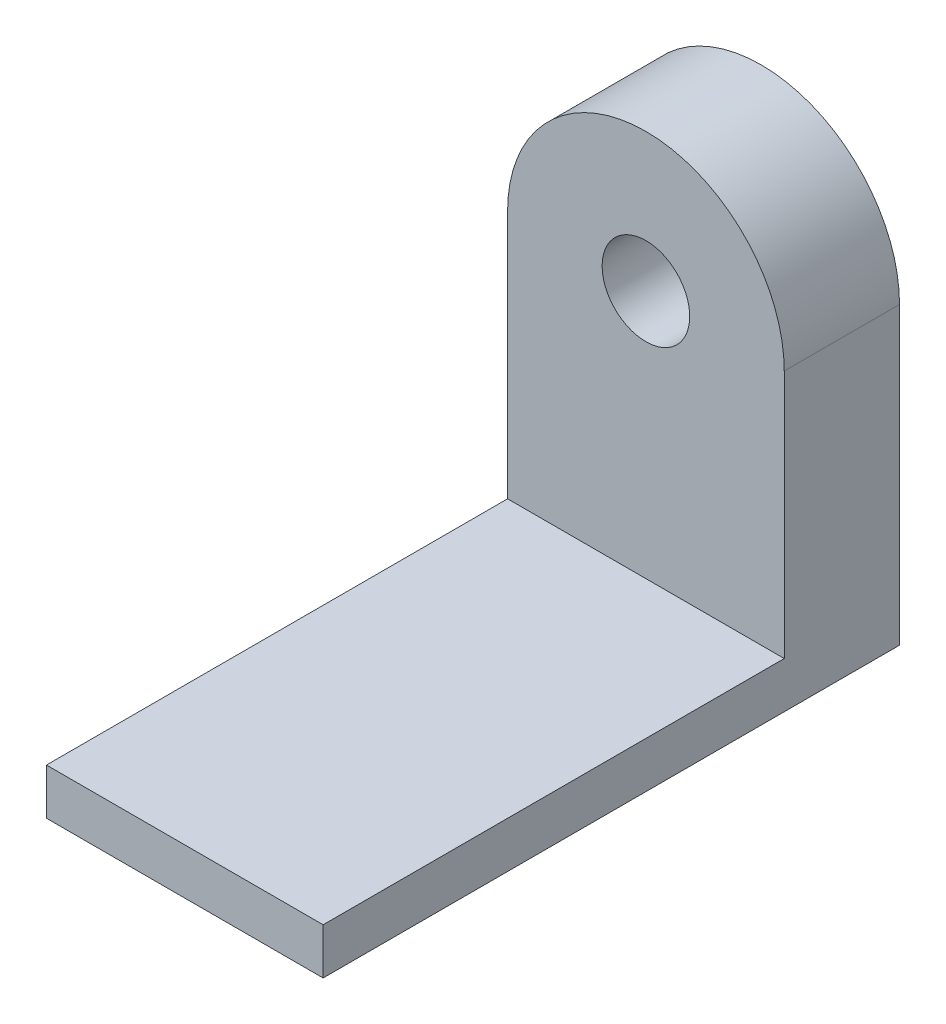
ISO-10303-21;
HEADER;
FILE_DESCRIPTION(('STEP AP214'),'2;1');
FILE_NAME('part.step','',(''),(''),'','','');
FILE_SCHEMA(('AUTOMOTIVE_DESIGN { 1 0 10303 214 1 1 1 1 }'));
ENDSEC;
DATA;
#1=APPLICATION_CONTEXT('core data for automotive mechanical design processes');
#2=APPLICATION_PROTOCOL_DEFINITION('international standard','automotive_design',2000,#1);
#3=PRODUCT_CONTEXT('',#1,'mechanical');
#4=PRODUCT('Part','Part','',(#3));
#5=PRODUCT_RELATED_PRODUCT_CATEGORY('part','',(#4));
#6=PRODUCT_DEFINITION_FORMATION('','',#4);
#7=PRODUCT_DEFINITION_CONTEXT('part definition',#1,'design');
#8=PRODUCT_DEFINITION('design','',#6,#7);
#9=PRODUCT_DEFINITION_SHAPE('','',#8);
#10=(LENGTH_UNIT() NAMED_UNIT(*) SI_UNIT(.MILLI.,.METRE.));
#11=(NAMED_UNIT(*) PLANE_ANGLE_UNIT() SI_UNIT($,.RADIAN.));
#12=(NAMED_UNIT(*) SI_UNIT($,.STERADIAN.) SOLID_ANGLE_UNIT());
#13=UNCERTAINTY_MEASURE_WITH_UNIT(LENGTH_MEASURE(1.E-05),#10,'distance_accuracy_value','');
#14=(GEOMETRIC_REPRESENTATION_CONTEXT(3) GLOBAL_UNCERTAINTY_ASSIGNED_CONTEXT((#13)) GLOBAL_UNIT_ASSIGNED_CONTEXT((#10,
#11,#12)) REPRESENTATION_CONTEXT('',''));
#15=CARTESIAN_POINT('',(0.,0.,0.));
#16=DIRECTION('',(0.,0.,1.));
#17=DIRECTION('',(1.,0.,0.));
#18=AXIS2_PLACEMENT_3D('',#15,#16,#17);
#19=CARTESIAN_POINT('',(0.,10.,0.));
#20=DIRECTION('',(1.,0.,0.));
#21=DIRECTION('',(0.,0.,-1.));
#22=AXIS2_PLACEMENT_3D('',#19,#20,#21);
#23=PLANE('',#22);
#24=DIRECTION('',(0.,0.,1.));
#25=VECTOR('',#24,1.);
#26=CARTESIAN_POINT('',(0.,0.,0.));
#27=LINE('',#26,#25);
#28=CARTESIAN_POINT('',(0.,0.,-125.));
#29=VERTEX_POINT('',#28);
#30=CARTESIAN_POINT('',(0.,0.,0.));
#31=VERTEX_POINT('',#30);
#32=EDGE_CURVE('E99',#29,#31,#27,.T.);
#33=ORIENTED_EDGE('',*,*,#32,.T.);
#34=DIRECTION('',(0.,-1.,0.));
#35=VECTOR('',#34,1.);
#36=CARTESIAN_POINT('',(0.,10.,0.));
#37=LINE('',#36,#35);
#38=CARTESIAN_POINT('',(0.,10.,0.));
#39=VERTEX_POINT('',#38);
#40=EDGE_CURVE('E11',#39,#31,#37,.T.);
#41=ORIENTED_EDGE('',*,*,#40,.F.);
#42=DIRECTION('',(0.,0.,1.));
#43=VECTOR('',#42,1.);
#44=CARTESIAN_POINT('',(0.,10.,0.));
#45=LINE('',#44,#43);
#46=CARTESIAN_POINT('',(0.,10.,-100.));
#47=VERTEX_POINT('',#46);
#48=EDGE_CURVE('E93',#47,#39,#45,.T.);
#49=ORIENTED_EDGE('',*,*,#48,.F.);
#50=DIRECTION('',(0.,1.,0.));
#51=VECTOR('',#50,1.);
#52=CARTESIAN_POINT('',(0.,10.,-100.));
#53=LINE('',#52,#51);
#54=CARTESIAN_POINT('',(0.,64.,-100.));
#55=VERTEX_POINT('',#54);
#56=EDGE_CURVE('E51',#47,#55,#53,.T.);
#57=ORIENTED_EDGE('',*,*,#56,.T.);
#58=DIRECTION('',(0.,0.,-1.));
#59=VECTOR('',#58,1.);
#60=CARTESIAN_POINT('',(0.,64.,-100.));
#61=LINE('',#60,#59);
#62=CARTESIAN_POINT('',(0.,64.,-125.));
#63=VERTEX_POINT('',#62);
#64=EDGE_CURVE('E101',#55,#63,#61,.T.);
#65=ORIENTED_EDGE('',*,*,#64,.T.);
#66=DIRECTION('',(0.,-1.,0.));
#67=VECTOR('',#66,1.);
#68=CARTESIAN_POINT('',(0.,10.,-125.));
#69=LINE('',#68,#67);
#70=EDGE_CURVE('E86',#63,#29,#69,.T.);
#71=ORIENTED_EDGE('',*,*,#70,.T.);
#72=EDGE_LOOP('',(#33,#41,#49,#57,#65,#71));
#73=FACE_BOUND('',#72,.T.);
#74=ADVANCED_FACE('F35',(#73),#23,.F.);
#75=CARTESIAN_POINT('',(0.,10.,0.));
#76=DIRECTION('',(0.,0.,-1.));
#77=DIRECTION('',(-1.,0.,0.));
#78=AXIS2_PLACEMENT_3D('',#75,#76,#77);
#79=PLANE('',#78);
#80=DIRECTION('',(1.,0.,0.));
#81=VECTOR('',#80,1.);
#82=CARTESIAN_POINT('',(0.,0.,0.));
#83=LINE('',#82,#81);
#84=CARTESIAN_POINT('',(60.,0.,0.));
#85=VERTEX_POINT('',#84);
#86=EDGE_CURVE('E106',#31,#85,#83,.T.);
#87=ORIENTED_EDGE('',*,*,#86,.T.);
#88=DIRECTION('',(0.,-1.,0.));
#89=VECTOR('',#88,1.);
#90=CARTESIAN_POINT('',(60.,10.,0.));
#91=LINE('',#90,#89);
#92=CARTESIAN_POINT('',(60.,10.,0.));
#93=VERTEX_POINT('',#92);
#94=EDGE_CURVE('E43',#93,#85,#91,.T.);
#95=ORIENTED_EDGE('',*,*,#94,.F.);
#96=DIRECTION('',(1.,0.,0.));
#97=VECTOR('',#96,1.);
#98=CARTESIAN_POINT('',(0.,10.,0.));
#99=LINE('',#98,#97);
#100=EDGE_CURVE('E60',#39,#93,#99,.T.);
#101=ORIENTED_EDGE('',*,*,#100,.F.);
#102=ORIENTED_EDGE('',*,*,#40,.T.);
#103=EDGE_LOOP('',(#87,#95,#101,#102));
#104=FACE_BOUND('',#103,.T.);
#105=ADVANCED_FACE('F172',(#104),#79,.F.);
#106=CARTESIAN_POINT('',(60.,10.,0.));
#107=DIRECTION('',(-1.,0.,0.));
#108=DIRECTION('',(0.,0.,1.));
#109=AXIS2_PLACEMENT_3D('',#106,#107,#108);
#110=PLANE('',#109);
#111=DIRECTION('',(0.,0.,-1.));
#112=VECTOR('',#111,1.);
#113=CARTESIAN_POINT('',(60.,0.,0.));
#114=LINE('',#113,#112);
#115=CARTESIAN_POINT('',(60.,0.,-125.));
#116=VERTEX_POINT('',#115);
#117=EDGE_CURVE('E94',#85,#116,#114,.T.);
#118=ORIENTED_EDGE('',*,*,#117,.T.);
#119=DIRECTION('',(0.,-1.,0.));
#120=VECTOR('',#119,1.);
#121=CARTESIAN_POINT('',(60.,10.,-125.));
#122=LINE('',#121,#120);
#123=CARTESIAN_POINT('',(60.,64.,-125.));
#124=VERTEX_POINT('',#123);
#125=EDGE_CURVE('E89',#124,#116,#122,.T.);
#126=ORIENTED_EDGE('',*,*,#125,.F.);
#127=DIRECTION('',(0.,0.,-1.));
#128=VECTOR('',#127,1.);
#129=CARTESIAN_POINT('',(60.,64.,-100.));
#130=LINE('',#129,#128);
#131=CARTESIAN_POINT('',(60.,64.,-100.));
#132=VERTEX_POINT('',#131);
#133=EDGE_CURVE('E107',#132,#124,#130,.T.);
#134=ORIENTED_EDGE('',*,*,#133,.F.);
#135=DIRECTION('',(0.,-1.,0.));
#136=VECTOR('',#135,1.);
#137=CARTESIAN_POINT('',(60.,10.,-100.));
#138=LINE('',#137,#136);
#139=CARTESIAN_POINT('',(60.,10.,-100.));
#140=VERTEX_POINT('',#139);
#141=EDGE_CURVE('E138',#132,#140,#138,.T.);
#142=ORIENTED_EDGE('',*,*,#141,.T.);
#143=DIRECTION('',(0.,0.,-1.));
#144=VECTOR('',#143,1.);
#145=CARTESIAN_POINT('',(60.,10.,0.));
#146=LINE('',#145,#144);
#147=EDGE_CURVE('E103',#93,#140,#146,.T.);
#148=ORIENTED_EDGE('',*,*,#147,.F.);
#149=ORIENTED_EDGE('',*,*,#94,.T.);
#150=EDGE_LOOP('',(#118,#126,#134,#142,#148,#149));
#151=FACE_BOUND('',#150,.T.);
#152=ADVANCED_FACE('F135',(#151),#110,.F.);
#153=CARTESIAN_POINT('',(0.,10.,-125.));
#154=DIRECTION('',(0.,0.,1.));
#155=DIRECTION('',(1.,0.,0.));
#156=AXIS2_PLACEMENT_3D('',#153,#154,#155);
#157=PLANE('',#156);
#158=DIRECTION('',(-1.,0.,0.));
#159=VECTOR('',#158,1.);
#160=CARTESIAN_POINT('',(0.,0.,-125.));
#161=LINE('',#160,#159);
#162=EDGE_CURVE('E80',#116,#29,#161,.T.);
#163=ORIENTED_EDGE('',*,*,#162,.T.);
#164=ORIENTED_EDGE('',*,*,#70,.F.);
#165=CARTESIAN_POINT('',(30.,64.,-125.));
#166=DIRECTION('',(0.,0.,-1.));
#167=DIRECTION('',(-1.,0.,0.));
#168=AXIS2_PLACEMENT_3D('',#165,#166,#167);
#169=CIRCLE('',#168,30.);
#170=EDGE_CURVE('E140',#63,#124,#169,.T.);
#171=ORIENTED_EDGE('',*,*,#170,.T.);
#172=ORIENTED_EDGE('',*,*,#125,.T.);
#173=EDGE_LOOP('',(#163,#164,#171,#172));
#174=FACE_BOUND('',#173,.T.);
#175=CARTESIAN_POINT('',(30.,64.,-125.));
#176=DIRECTION('',(0.,0.,-1.));
#177=DIRECTION('',(-1.,0.,0.));
#178=AXIS2_PLACEMENT_3D('',#175,#176,#177);
#179=CIRCLE('',#178,9.5);
#180=CARTESIAN_POINT('',(20.5,64.,-125.));
#181=VERTEX_POINT('',#180);
#182=EDGE_CURVE('E151',#181,#181,#179,.T.);
#183=ORIENTED_EDGE('',*,*,#182,.F.);
#184=EDGE_LOOP('',(#183));
#185=FACE_BOUND('',#184,.T.);
#186=ADVANCED_FACE('F82',(#174,#185),#157,.F.);
#187=CARTESIAN_POINT('',(0.,10.,-125.));
#188=DIRECTION('',(0.,-1.,0.));
#189=DIRECTION('',(0.,0.,-1.));
#190=AXIS2_PLACEMENT_3D('',#187,#188,#189);
#191=PLANE('',#190);
#192=ORIENTED_EDGE('',*,*,#147,.T.);
#193=DIRECTION('',(-1.,0.,0.));
#194=VECTOR('',#193,1.);
#195=CARTESIAN_POINT('',(60.,10.,-100.));
#196=LINE('',#195,#194);
#197=EDGE_CURVE('E128',#140,#47,#196,.T.);
#198=ORIENTED_EDGE('',*,*,#197,.T.);
#199=ORIENTED_EDGE('',*,*,#48,.T.);
#200=ORIENTED_EDGE('',*,*,#100,.T.);
#201=EDGE_LOOP('',(#192,#198,#199,#200));
#202=FACE_BOUND('',#201,.T.);
#203=ADVANCED_FACE('F127',(#202),#191,.F.);
#204=CARTESIAN_POINT('',(0.,0.,-125.));
#205=DIRECTION('',(0.,-1.,0.));
#206=DIRECTION('',(0.,0.,-1.));
#207=AXIS2_PLACEMENT_3D('',#204,#205,#206);
#208=PLANE('',#207);
#209=ORIENTED_EDGE('',*,*,#32,.F.);
#210=ORIENTED_EDGE('',*,*,#162,.F.);
#211=ORIENTED_EDGE('',*,*,#117,.F.);
#212=ORIENTED_EDGE('',*,*,#86,.F.);
#213=EDGE_LOOP('',(#209,#210,#211,#212));
#214=FACE_BOUND('',#213,.T.);
#215=ADVANCED_FACE('F105',(#214),#208,.T.);
#216=CARTESIAN_POINT('',(30.,64.,-100.));
#217=DIRECTION('',(0.,0.,-1.));
#218=DIRECTION('',(-1.,0.,0.));
#219=AXIS2_PLACEMENT_3D('',#216,#217,#218);
#220=CYLINDRICAL_SURFACE('',#219,30.);
#221=ORIENTED_EDGE('',*,*,#170,.F.);
#222=ORIENTED_EDGE('',*,*,#64,.F.);
#223=CARTESIAN_POINT('',(30.,64.,-100.));
#224=DIRECTION('',(0.,0.,-1.));
#225=DIRECTION('',(-1.,0.,0.));
#226=AXIS2_PLACEMENT_3D('',#223,#224,#225);
#227=CIRCLE('',#226,30.);
#228=EDGE_CURVE('E146',#55,#132,#227,.T.);
#229=ORIENTED_EDGE('',*,*,#228,.T.);
#230=ORIENTED_EDGE('',*,*,#133,.T.);
#231=EDGE_LOOP('',(#221,#222,#229,#230));
#232=FACE_BOUND('',#231,.T.);
#233=ADVANCED_FACE('F154',(#232),#220,.T.);
#234=CARTESIAN_POINT('',(30.,64.,-100.));
#235=DIRECTION('',(0.,0.,-1.));
#236=DIRECTION('',(-1.,0.,0.));
#237=AXIS2_PLACEMENT_3D('',#234,#235,#236);
#238=PLANE('',#237);
#239=CARTESIAN_POINT('',(30.,64.,-100.));
#240=DIRECTION('',(0.,0.,-1.));
#241=DIRECTION('',(-1.,0.,0.));
#242=AXIS2_PLACEMENT_3D('',#239,#240,#241);
#243=CIRCLE('',#242,9.5);
#244=CARTESIAN_POINT('',(20.5,64.,-100.));
#245=VERTEX_POINT('',#244);
#246=EDGE_CURVE('E141',#245,#245,#243,.T.);
#247=ORIENTED_EDGE('',*,*,#246,.T.);
#248=EDGE_LOOP('',(#247));
#249=FACE_BOUND('',#248,.T.);
#250=ORIENTED_EDGE('',*,*,#141,.F.);
#251=ORIENTED_EDGE('',*,*,#228,.F.);
#252=ORIENTED_EDGE('',*,*,#56,.F.);
#253=ORIENTED_EDGE('',*,*,#197,.F.);
#254=EDGE_LOOP('',(#250,#251,#252,#253));
#255=FACE_BOUND('',#254,.T.);
#256=ADVANCED_FACE('F156',(#249,#255),#238,.F.);
#257=CARTESIAN_POINT('',(30.,64.,-100.));
#258=DIRECTION('',(0.,0.,-1.));
#259=DIRECTION('',(-1.,0.,0.));
#260=AXIS2_PLACEMENT_3D('',#257,#258,#259);
#261=CYLINDRICAL_SURFACE('',#260,9.5);
#262=ORIENTED_EDGE('',*,*,#246,.F.);
#263=EDGE_LOOP('',(#262));
#264=FACE_BOUND('',#263,.T.);
#265=ORIENTED_EDGE('',*,*,#182,.T.);
#266=EDGE_LOOP('',(#265));
#267=FACE_BOUND('',#266,.T.);
#268=ADVANCED_FACE('F160',(#264,#267),#261,.F.);
#269=CLOSED_SHELL('',(#74,#105,#152,#186,#203,#215,#233,#256,#268));
#270=MANIFOLD_SOLID_BREP('B2',#269);
#271=ADVANCED_BREP_SHAPE_REPRESENTATION('',(#18,#270),#14);
#272=SHAPE_DEFINITION_REPRESENTATION(#9,#271);
ENDSEC;
END-ISO-10303-21;
